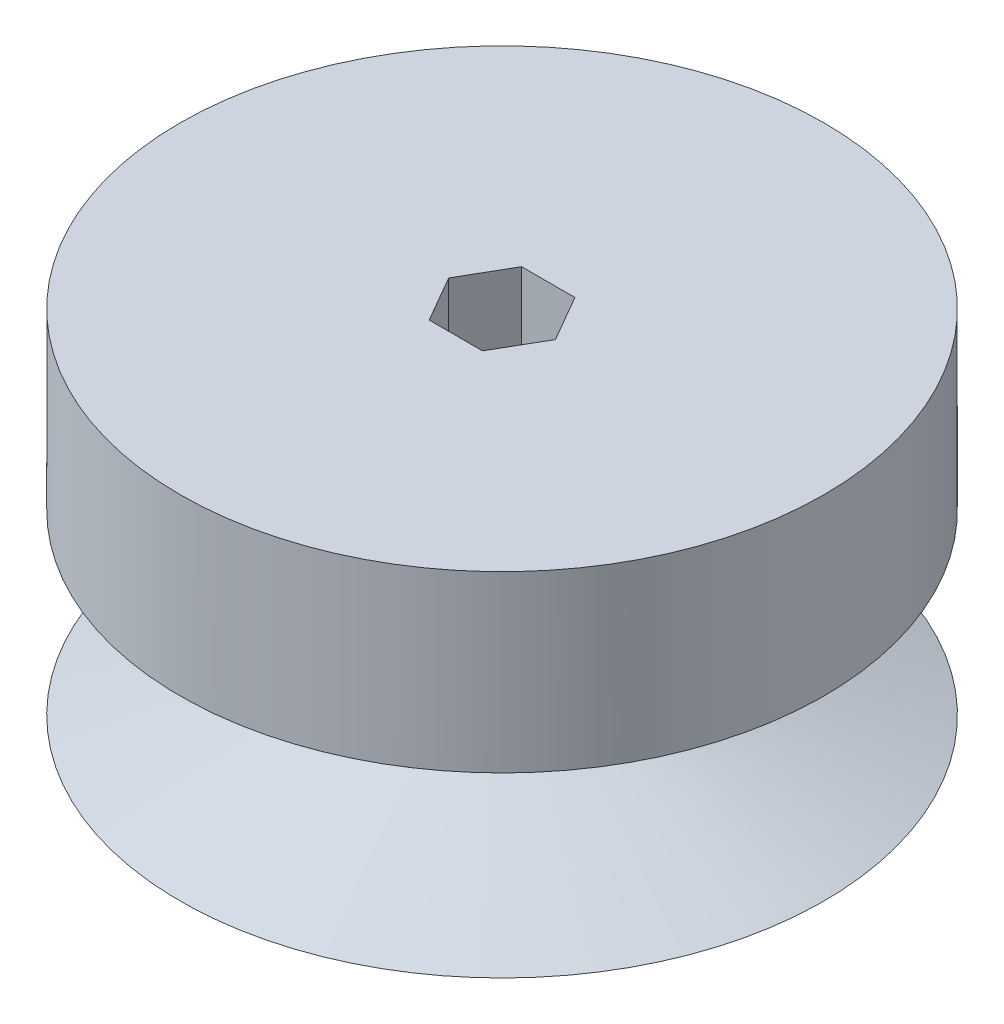
ISO-10303-21;
HEADER;
FILE_DESCRIPTION(('STEP AP214'),'2;1');
FILE_NAME('part.step','',(''),(''),'','','');
FILE_SCHEMA(('AUTOMOTIVE_DESIGN { 1 0 10303 214 1 1 1 1 }'));
ENDSEC;
DATA;
#1=APPLICATION_CONTEXT('core data for automotive mechanical design processes');
#2=APPLICATION_PROTOCOL_DEFINITION('international standard','automotive_design',2000,#1);
#3=PRODUCT_CONTEXT('',#1,'mechanical');
#4=PRODUCT('Part','Part','',(#3));
#5=PRODUCT_RELATED_PRODUCT_CATEGORY('part','',(#4));
#6=PRODUCT_DEFINITION_FORMATION('','',#4);
#7=PRODUCT_DEFINITION_CONTEXT('part definition',#1,'design');
#8=PRODUCT_DEFINITION('design','',#6,#7);
#9=PRODUCT_DEFINITION_SHAPE('','',#8);
#10=(LENGTH_UNIT() NAMED_UNIT(*) SI_UNIT(.MILLI.,.METRE.));
#11=(NAMED_UNIT(*) PLANE_ANGLE_UNIT() SI_UNIT($,.RADIAN.));
#12=(NAMED_UNIT(*) SI_UNIT($,.STERADIAN.) SOLID_ANGLE_UNIT());
#13=UNCERTAINTY_MEASURE_WITH_UNIT(LENGTH_MEASURE(1.E-05),#10,'distance_accuracy_value','');
#14=(GEOMETRIC_REPRESENTATION_CONTEXT(3) GLOBAL_UNCERTAINTY_ASSIGNED_CONTEXT((#13)) GLOBAL_UNIT_ASSIGNED_CONTEXT((#10,
#11,#12)) REPRESENTATION_CONTEXT('',''));
#15=CARTESIAN_POINT('',(0.,0.,0.));
#16=DIRECTION('',(0.,0.,1.));
#17=DIRECTION('',(1.,0.,0.));
#18=AXIS2_PLACEMENT_3D('',#15,#16,#17);
#19=CARTESIAN_POINT('',(0.,12.400000216,0.));
#20=DIRECTION('',(0.,-1.,0.));
#21=DIRECTION('',(0.,0.,1.));
#22=AXIS2_PLACEMENT_3D('',#19,#20,#21);
#23=PLANE('',#22);
#24=DIRECTION('',(-0.5,0.,0.866025403784439));
#25=VECTOR('',#24,1.);
#26=CARTESIAN_POINT('',(5.49926131403118,12.400000216,3.175));
#27=LINE('',#26,#25);
#28=CARTESIAN_POINT('',(7.33234841870825,12.400000216,0.));
#29=VERTEX_POINT('',#28);
#30=CARTESIAN_POINT('',(3.66617420935412,12.400000216,6.35));
#31=VERTEX_POINT('',#30);
#32=EDGE_CURVE('E148',#29,#31,#27,.T.);
#33=ORIENTED_EDGE('',*,*,#32,.F.);
#34=DIRECTION('',(0.5,0.,0.866025403784439));
#35=VECTOR('',#34,1.);
#36=CARTESIAN_POINT('',(5.49926131403119,12.400000216,-3.175));
#37=LINE('',#36,#35);
#38=CARTESIAN_POINT('',(3.66617420935412,12.400000216,-6.35));
#39=VERTEX_POINT('',#38);
#40=EDGE_CURVE('E133',#39,#29,#37,.T.);
#41=ORIENTED_EDGE('',*,*,#40,.F.);
#42=DIRECTION('',(1.,0.,0.));
#43=VECTOR('',#42,1.);
#44=CARTESIAN_POINT('',(0.,12.400000216,-6.35));
#45=LINE('',#44,#43);
#46=CARTESIAN_POINT('',(-3.66617420935412,12.400000216,-6.35));
#47=VERTEX_POINT('',#46);
#48=EDGE_CURVE('E106',#47,#39,#45,.T.);
#49=ORIENTED_EDGE('',*,*,#48,.F.);
#50=DIRECTION('',(0.5,0.,-0.866025403784439));
#51=VECTOR('',#50,1.);
#52=CARTESIAN_POINT('',(-5.49926131403118,12.400000216,-3.175));
#53=LINE('',#52,#51);
#54=CARTESIAN_POINT('',(-7.33234841870825,12.400000216,0.));
#55=VERTEX_POINT('',#54);
#56=EDGE_CURVE('E142',#55,#47,#53,.T.);
#57=ORIENTED_EDGE('',*,*,#56,.F.);
#58=DIRECTION('',(-0.5,0.,-0.866025403784439));
#59=VECTOR('',#58,1.);
#60=CARTESIAN_POINT('',(-5.49926131403118,12.400000216,3.175));
#61=LINE('',#60,#59);
#62=CARTESIAN_POINT('',(-3.66617420935412,12.400000216,6.35));
#63=VERTEX_POINT('',#62);
#64=EDGE_CURVE('E144',#63,#55,#61,.T.);
#65=ORIENTED_EDGE('',*,*,#64,.F.);
#66=DIRECTION('',(-1.,0.,0.));
#67=VECTOR('',#66,1.);
#68=CARTESIAN_POINT('',(0.,12.400000216,6.35));
#69=LINE('',#68,#67);
#70=EDGE_CURVE('E146',#31,#63,#69,.T.);
#71=ORIENTED_EDGE('',*,*,#70,.F.);
#72=EDGE_LOOP('',(#33,#41,#49,#57,#65,#71));
#73=FACE_BOUND('',#72,.T.);
#74=CARTESIAN_POINT('',(0.,12.400000216,0.));
#75=DIRECTION('',(0.,1.,0.));
#76=DIRECTION('',(0.,0.,1.));
#77=AXIS2_PLACEMENT_3D('',#74,#75,#76);
#78=CIRCLE('',#77,12.);
#79=CARTESIAN_POINT('',(0.,12.400000216,-12.));
#80=VERTEX_POINT('',#79);
#81=EDGE_CURVE('E55',#80,#80,#78,.T.);
#82=ORIENTED_EDGE('',*,*,#81,.F.);
#83=EDGE_LOOP('',(#82));
#84=FACE_BOUND('',#83,.T.);
#85=ADVANCED_FACE('F46',(#73,#84),#23,.T.);
#86=CARTESIAN_POINT('',(0.,12.400000216,0.));
#87=DIRECTION('',(0.,1.,0.));
#88=DIRECTION('',(0.,0.,-1.));
#89=AXIS2_PLACEMENT_3D('',#86,#87,#88);
#90=CONICAL_SURFACE('',#89,12.,1.21457667139875);
#91=CARTESIAN_POINT('',(0.,24.400000216,0.));
#92=DIRECTION('',(0.,1.,0.));
#93=DIRECTION('',(0.,0.,1.));
#94=AXIS2_PLACEMENT_3D('',#91,#92,#93);
#95=CIRCLE('',#94,44.25);
#96=CARTESIAN_POINT('',(0.,24.400000216,-44.25));
#97=VERTEX_POINT('',#96);
#98=EDGE_CURVE('E13',#97,#97,#95,.T.);
#99=CARTESIAN_POINT('',(0.,12.400000216,-12.));
#100=CARTESIAN_POINT('',(0.,12.525000216,-12.3359375));
#101=CARTESIAN_POINT('',(0.,12.650000216,-12.671875));
#102=CARTESIAN_POINT('',(0.,12.900000216,-13.34375));
#103=CARTESIAN_POINT('',(0.,13.025000216,-13.6796875));
#104=CARTESIAN_POINT('',(0.,13.275000216,-14.3515625));
#105=CARTESIAN_POINT('',(0.,13.400000216,-14.6875));
#106=CARTESIAN_POINT('',(0.,13.650000216,-15.359375));
#107=CARTESIAN_POINT('',(0.,13.775000216,-15.6953125));
#108=CARTESIAN_POINT('',(0.,14.025000216,-16.3671875));
#109=CARTESIAN_POINT('',(0.,14.150000216,-16.703125));
#110=CARTESIAN_POINT('',(0.,14.400000216,-17.375));
#111=CARTESIAN_POINT('',(0.,14.525000216,-17.7109375));
#112=CARTESIAN_POINT('',(0.,14.775000216,-18.3828125));
#113=CARTESIAN_POINT('',(0.,14.900000216,-18.71875));
#114=CARTESIAN_POINT('',(0.,15.150000216,-19.390625));
#115=CARTESIAN_POINT('',(0.,15.275000216,-19.7265625));
#116=CARTESIAN_POINT('',(0.,15.525000216,-20.3984375));
#117=CARTESIAN_POINT('',(0.,15.650000216,-20.734375));
#118=CARTESIAN_POINT('',(0.,15.900000216,-21.40625));
#119=CARTESIAN_POINT('',(0.,16.025000216,-21.7421875));
#120=CARTESIAN_POINT('',(0.,16.275000216,-22.4140625));
#121=CARTESIAN_POINT('',(0.,16.400000216,-22.75));
#122=CARTESIAN_POINT('',(0.,16.650000216,-23.421875));
#123=CARTESIAN_POINT('',(0.,16.775000216,-23.7578125));
#124=CARTESIAN_POINT('',(0.,17.025000216,-24.4296875));
#125=CARTESIAN_POINT('',(0.,17.150000216,-24.765625));
#126=CARTESIAN_POINT('',(0.,17.400000216,-25.4375));
#127=CARTESIAN_POINT('',(0.,17.525000216,-25.7734375));
#128=CARTESIAN_POINT('',(0.,17.775000216,-26.4453125));
#129=CARTESIAN_POINT('',(0.,17.900000216,-26.78125));
#130=CARTESIAN_POINT('',(0.,18.150000216,-27.453125));
#131=CARTESIAN_POINT('',(0.,18.275000216,-27.7890625));
#132=CARTESIAN_POINT('',(0.,18.525000216,-28.4609375));
#133=CARTESIAN_POINT('',(0.,18.650000216,-28.796875));
#134=CARTESIAN_POINT('',(0.,18.900000216,-29.46875));
#135=CARTESIAN_POINT('',(0.,19.025000216,-29.8046875));
#136=CARTESIAN_POINT('',(0.,19.275000216,-30.4765625));
#137=CARTESIAN_POINT('',(0.,19.400000216,-30.8125));
#138=CARTESIAN_POINT('',(0.,19.650000216,-31.484375));
#139=CARTESIAN_POINT('',(0.,19.775000216,-31.8203125));
#140=CARTESIAN_POINT('',(0.,20.025000216,-32.4921875));
#141=CARTESIAN_POINT('',(0.,20.150000216,-32.828125));
#142=CARTESIAN_POINT('',(0.,20.400000216,-33.5));
#143=CARTESIAN_POINT('',(0.,20.525000216,-33.8359375));
#144=CARTESIAN_POINT('',(0.,20.775000216,-34.5078125));
#145=CARTESIAN_POINT('',(0.,20.900000216,-34.84375));
#146=CARTESIAN_POINT('',(0.,21.150000216,-35.515625));
#147=CARTESIAN_POINT('',(0.,21.275000216,-35.8515625));
#148=CARTESIAN_POINT('',(0.,21.525000216,-36.5234375));
#149=CARTESIAN_POINT('',(0.,21.650000216,-36.859375));
#150=CARTESIAN_POINT('',(0.,21.900000216,-37.53125));
#151=CARTESIAN_POINT('',(0.,22.025000216,-37.8671875));
#152=CARTESIAN_POINT('',(0.,22.275000216,-38.5390625));
#153=CARTESIAN_POINT('',(0.,22.400000216,-38.875));
#154=CARTESIAN_POINT('',(0.,22.650000216,-39.546875));
#155=CARTESIAN_POINT('',(0.,22.775000216,-39.8828125));
#156=CARTESIAN_POINT('',(0.,23.025000216,-40.5546875));
#157=CARTESIAN_POINT('',(0.,23.150000216,-40.890625));
#158=CARTESIAN_POINT('',(0.,23.400000216,-41.5625));
#159=CARTESIAN_POINT('',(0.,23.525000216,-41.8984375));
#160=CARTESIAN_POINT('',(0.,23.775000216,-42.5703125));
#161=CARTESIAN_POINT('',(0.,23.900000216,-42.90625));
#162=CARTESIAN_POINT('',(0.,24.150000216,-43.578125));
#163=CARTESIAN_POINT('',(0.,24.275000216,-43.9140625));
#164=CARTESIAN_POINT('',(0.,24.400000216,-44.25));
#165=B_SPLINE_CURVE_WITH_KNOTS('',3,(#99,#100,#101,#102,#103,#104,#105,#106,#107,#108,#109,#110,
#111,#112,#113,#114,#115,#116,#117,#118,#119,#120,#121,#122,#123,#124,#125,#126,#127,#128,#129,
#130,#131,#132,#133,#134,#135,#136,#137,#138,#139,#140,#141,#142,#143,#144,#145,#146,#147,#148,
#149,#150,#151,#152,#153,#154,#155,#156,#157,#158,#159,#160,#161,#162,#163,#164),.UNSPECIFIED.,
.F.,.F.,(4,2,2,2,2,2,2,2,2,2,2,2,2,2,2,2,2,2,2,2,2,2,2,2,2,2,2,2,2,2,2,2,4),(0.,
1.07531903877698,2.15063807755396,3.22595711633094,4.30127615510792,5.3765951938849,
6.45191423266188,7.52723327143887,8.60255231021585,9.67787134899283,10.7531903877698,
11.8285094265468,12.9038284653238,13.9791475041008,15.0544665428777,16.1297855816547,
17.2051046204317,18.2804236592087,19.3557426979857,20.4310617367626,21.5063807755396,
22.5816998143166,23.6570188530936,24.7323378918706,25.8076569306475,26.8829759694245,
27.9582950082015,29.0336140469785,30.1089330857554,31.1842521245324,32.2595711633094,
33.3348902020864,34.4102092408634),.UNSPECIFIED.);
#166=EDGE_CURVE('BSEAM48',#80,#97,#165,.T.);
#167=ORIENTED_EDGE('',*,*,#81,.T.);
#168=ORIENTED_EDGE('',*,*,#98,.F.);
#169=ORIENTED_EDGE('',*,*,#166,.T.);
#170=ORIENTED_EDGE('',*,*,#166,.F.);
#171=EDGE_LOOP('',(#167,#169,#168,#170));
#172=FACE_BOUND('',#171,.T.);
#173=ADVANCED_FACE('F48',(#172),#90,.T.);
#174=CARTESIAN_POINT('',(0.,48.35600031,0.));
#175=DIRECTION('',(0.,-1.,0.));
#176=DIRECTION('',(0.,0.,-1.));
#177=AXIS2_PLACEMENT_3D('',#174,#175,#176);
#178=CYLINDRICAL_SURFACE('',#177,44.25);
#179=CARTESIAN_POINT('',(0.,48.35600031,0.));
#180=DIRECTION('',(0.,1.,0.));
#181=DIRECTION('',(0.,0.,1.));
#182=AXIS2_PLACEMENT_3D('',#179,#180,#181);
#183=CIRCLE('',#182,44.25);
#184=CARTESIAN_POINT('',(0.,48.35600031,44.25));
#185=VERTEX_POINT('',#184);
#186=EDGE_CURVE('E150',#185,#185,#183,.T.);
#187=ORIENTED_EDGE('',*,*,#186,.F.);
#188=EDGE_LOOP('',(#187));
#189=FACE_BOUND('',#188,.T.);
#190=ORIENTED_EDGE('',*,*,#98,.T.);
#191=EDGE_LOOP('',(#190));
#192=FACE_BOUND('',#191,.T.);
#193=ADVANCED_FACE('F179',(#189,#192),#178,.T.);
#194=CARTESIAN_POINT('',(0.,48.35600031,0.));
#195=DIRECTION('',(0.,1.,0.));
#196=DIRECTION('',(0.,0.,1.));
#197=AXIS2_PLACEMENT_3D('',#194,#195,#196);
#198=PLANE('',#197);
#199=DIRECTION('',(0.5,0.,-0.866025403784439));
#200=VECTOR('',#199,1.);
#201=CARTESIAN_POINT('',(3.66617420935412,48.35600031,6.35));
#202=LINE('',#201,#200);
#203=CARTESIAN_POINT('',(3.66617420935412,48.35600031,6.35));
#204=VERTEX_POINT('',#203);
#205=CARTESIAN_POINT('',(7.33234841870825,48.35600031,0.));
#206=VERTEX_POINT('',#205);
#207=EDGE_CURVE('E70',#204,#206,#202,.T.);
#208=ORIENTED_EDGE('',*,*,#207,.F.);
#209=DIRECTION('',(1.,0.,0.));
#210=VECTOR('',#209,1.);
#211=CARTESIAN_POINT('',(-3.66617420935412,48.35600031,6.35));
#212=LINE('',#211,#210);
#213=CARTESIAN_POINT('',(-3.66617420935412,48.35600031,6.35));
#214=VERTEX_POINT('',#213);
#215=EDGE_CURVE('E128',#214,#204,#212,.T.);
#216=ORIENTED_EDGE('',*,*,#215,.F.);
#217=DIRECTION('',(0.5,0.,0.866025403784439));
#218=VECTOR('',#217,1.);
#219=CARTESIAN_POINT('',(-7.33234841870825,48.35600031,0.));
#220=LINE('',#219,#218);
#221=CARTESIAN_POINT('',(-7.33234841870825,48.35600031,0.));
#222=VERTEX_POINT('',#221);
#223=EDGE_CURVE('E122',#222,#214,#220,.T.);
#224=ORIENTED_EDGE('',*,*,#223,.F.);
#225=DIRECTION('',(-0.5,0.,0.866025403784439));
#226=VECTOR('',#225,1.);
#227=CARTESIAN_POINT('',(-3.66617420935412,48.35600031,-6.35));
#228=LINE('',#227,#226);
#229=CARTESIAN_POINT('',(-3.66617420935412,48.35600031,-6.35));
#230=VERTEX_POINT('',#229);
#231=EDGE_CURVE('E120',#230,#222,#228,.T.);
#232=ORIENTED_EDGE('',*,*,#231,.F.);
#233=DIRECTION('',(-1.,0.,0.));
#234=VECTOR('',#233,1.);
#235=CARTESIAN_POINT('',(3.66617420935412,48.35600031,-6.35));
#236=LINE('',#235,#234);
#237=CARTESIAN_POINT('',(3.66617420935412,48.35600031,-6.35));
#238=VERTEX_POINT('',#237);
#239=EDGE_CURVE('E103',#238,#230,#236,.T.);
#240=ORIENTED_EDGE('',*,*,#239,.F.);
#241=DIRECTION('',(-0.5,0.,-0.866025403784439));
#242=VECTOR('',#241,1.);
#243=CARTESIAN_POINT('',(7.33234841870825,48.35600031,0.));
#244=LINE('',#243,#242);
#245=EDGE_CURVE('E112',#206,#238,#244,.T.);
#246=ORIENTED_EDGE('',*,*,#245,.F.);
#247=EDGE_LOOP('',(#208,#216,#224,#232,#240,#246));
#248=FACE_BOUND('',#247,.T.);
#249=ORIENTED_EDGE('',*,*,#186,.T.);
#250=EDGE_LOOP('',(#249));
#251=FACE_BOUND('',#250,.T.);
#252=ADVANCED_FACE('F116',(#248,#251),#198,.T.);
#253=CARTESIAN_POINT('',(3.66617420935412,-9.99999999959367E-05,6.35));
#254=DIRECTION('',(0.866025403784439,0.,0.5));
#255=DIRECTION('',(0.5,0.,-0.866025403784439));
#256=AXIS2_PLACEMENT_3D('',#253,#254,#255);
#257=PLANE('',#256);
#258=ORIENTED_EDGE('',*,*,#32,.T.);
#259=DIRECTION('',(0.,1.,0.));
#260=VECTOR('',#259,1.);
#261=CARTESIAN_POINT('',(3.66617420935412,-9.99999999959367E-05,6.35));
#262=LINE('',#261,#260);
#263=EDGE_CURVE('E131',#31,#204,#262,.T.);
#264=ORIENTED_EDGE('',*,*,#263,.T.);
#265=ORIENTED_EDGE('',*,*,#207,.T.);
#266=DIRECTION('',(0.,1.,0.));
#267=VECTOR('',#266,1.);
#268=CARTESIAN_POINT('',(7.33234841870825,-9.99999999959367E-05,0.));
#269=LINE('',#268,#267);
#270=EDGE_CURVE('E109',#29,#206,#269,.T.);
#271=ORIENTED_EDGE('',*,*,#270,.F.);
#272=EDGE_LOOP('',(#258,#264,#265,#271));
#273=FACE_BOUND('',#272,.T.);
#274=ADVANCED_FACE('F185',(#273),#257,.F.);
#275=CARTESIAN_POINT('',(-3.66617420935412,-9.99999999959367E-05,6.35));
#276=DIRECTION('',(0.,0.,1.));
#277=DIRECTION('',(1.,0.,0.));
#278=AXIS2_PLACEMENT_3D('',#275,#276,#277);
#279=PLANE('',#278);
#280=ORIENTED_EDGE('',*,*,#70,.T.);
#281=DIRECTION('',(0.,1.,0.));
#282=VECTOR('',#281,1.);
#283=CARTESIAN_POINT('',(-3.66617420935412,-9.99999999959367E-05,6.35));
#284=LINE('',#283,#282);
#285=EDGE_CURVE('E134',#63,#214,#284,.T.);
#286=ORIENTED_EDGE('',*,*,#285,.T.);
#287=ORIENTED_EDGE('',*,*,#215,.T.);
#288=ORIENTED_EDGE('',*,*,#263,.F.);
#289=EDGE_LOOP('',(#280,#286,#287,#288));
#290=FACE_BOUND('',#289,.T.);
#291=ADVANCED_FACE('F188',(#290),#279,.F.);
#292=CARTESIAN_POINT('',(-7.33234841870825,-9.99999999959367E-05,0.));
#293=DIRECTION('',(-0.866025403784439,0.,0.5));
#294=DIRECTION('',(0.5,0.,0.866025403784439));
#295=AXIS2_PLACEMENT_3D('',#292,#293,#294);
#296=PLANE('',#295);
#297=ORIENTED_EDGE('',*,*,#64,.T.);
#298=DIRECTION('',(0.,1.,0.));
#299=VECTOR('',#298,1.);
#300=CARTESIAN_POINT('',(-7.33234841870825,-9.99999999959367E-05,0.));
#301=LINE('',#300,#299);
#302=EDGE_CURVE('E136',#55,#222,#301,.T.);
#303=ORIENTED_EDGE('',*,*,#302,.T.);
#304=ORIENTED_EDGE('',*,*,#223,.T.);
#305=ORIENTED_EDGE('',*,*,#285,.F.);
#306=EDGE_LOOP('',(#297,#303,#304,#305));
#307=FACE_BOUND('',#306,.T.);
#308=ADVANCED_FACE('F196',(#307),#296,.F.);
#309=CARTESIAN_POINT('',(-3.66617420935412,-9.99999999959367E-05,-6.35));
#310=DIRECTION('',(-0.866025403784439,0.,-0.5));
#311=DIRECTION('',(-0.5,0.,0.866025403784439));
#312=AXIS2_PLACEMENT_3D('',#309,#310,#311);
#313=PLANE('',#312);
#314=ORIENTED_EDGE('',*,*,#56,.T.);
#315=DIRECTION('',(0.,1.,0.));
#316=VECTOR('',#315,1.);
#317=CARTESIAN_POINT('',(-3.66617420935412,-9.99999999959367E-05,-6.35));
#318=LINE('',#317,#316);
#319=EDGE_CURVE('E108',#47,#230,#318,.T.);
#320=ORIENTED_EDGE('',*,*,#319,.T.);
#321=ORIENTED_EDGE('',*,*,#231,.T.);
#322=ORIENTED_EDGE('',*,*,#302,.F.);
#323=EDGE_LOOP('',(#314,#320,#321,#322));
#324=FACE_BOUND('',#323,.T.);
#325=ADVANCED_FACE('F193',(#324),#313,.F.);
#326=CARTESIAN_POINT('',(3.66617420935412,-9.99999999959367E-05,-6.35));
#327=DIRECTION('',(0.,0.,-1.));
#328=DIRECTION('',(-1.,0.,0.));
#329=AXIS2_PLACEMENT_3D('',#326,#327,#328);
#330=PLANE('',#329);
#331=ORIENTED_EDGE('',*,*,#48,.T.);
#332=DIRECTION('',(0.,1.,0.));
#333=VECTOR('',#332,1.);
#334=CARTESIAN_POINT('',(3.66617420935412,-9.99999999959367E-05,-6.35));
#335=LINE('',#334,#333);
#336=EDGE_CURVE('E62',#39,#238,#335,.T.);
#337=ORIENTED_EDGE('',*,*,#336,.T.);
#338=ORIENTED_EDGE('',*,*,#239,.T.);
#339=ORIENTED_EDGE('',*,*,#319,.F.);
#340=EDGE_LOOP('',(#331,#337,#338,#339));
#341=FACE_BOUND('',#340,.T.);
#342=ADVANCED_FACE('F100',(#341),#330,.F.);
#343=CARTESIAN_POINT('',(7.33234841870825,-9.99999999959367E-05,0.));
#344=DIRECTION('',(0.866025403784439,0.,-0.5));
#345=DIRECTION('',(-0.5,0.,-0.866025403784439));
#346=AXIS2_PLACEMENT_3D('',#343,#344,#345);
#347=PLANE('',#346);
#348=ORIENTED_EDGE('',*,*,#40,.T.);
#349=ORIENTED_EDGE('',*,*,#270,.T.);
#350=ORIENTED_EDGE('',*,*,#245,.T.);
#351=ORIENTED_EDGE('',*,*,#336,.F.);
#352=EDGE_LOOP('',(#348,#349,#350,#351));
#353=FACE_BOUND('',#352,.T.);
#354=ADVANCED_FACE('F113',(#353),#347,.F.);
#355=CLOSED_SHELL('',(#85,#173,#193,#252,#274,#291,#308,#325,#342,#354));
#356=MANIFOLD_SOLID_BREP('B2',#355);
#357=CARTESIAN_POINT('',(0.,0.,0.));
#358=DIRECTION('',(0.,1.,0.));
#359=DIRECTION('',(0.,0.,1.));
#360=AXIS2_PLACEMENT_3D('',#357,#358,#359);
#361=PLANE('',#360);
#362=DIRECTION('',(1.,0.,0.));
#363=VECTOR('',#362,1.);
#364=CARTESIAN_POINT('',(0.,0.,6.35));
#365=LINE('',#364,#363);
#366=CARTESIAN_POINT('',(-3.66617420935412,0.,6.35));
#367=VERTEX_POINT('',#366);
#368=CARTESIAN_POINT('',(3.66617420935412,0.,6.35));
#369=VERTEX_POINT('',#368);
#370=EDGE_CURVE('E347',#367,#369,#365,.T.);
#371=ORIENTED_EDGE('',*,*,#370,.T.);
#372=DIRECTION('',(0.5,0.,-0.866025403784439));
#373=VECTOR('',#372,1.);
#374=CARTESIAN_POINT('',(5.49926131403118,0.,3.175));
#375=LINE('',#374,#373);
#376=CARTESIAN_POINT('',(7.33234841870825,0.,0.));
#377=VERTEX_POINT('',#376);
#378=EDGE_CURVE('E339',#369,#377,#375,.T.);
#379=ORIENTED_EDGE('',*,*,#378,.T.);
#380=DIRECTION('',(-0.5,0.,-0.866025403784439));
#381=VECTOR('',#380,1.);
#382=CARTESIAN_POINT('',(5.49926131403119,0.,-3.175));
#383=LINE('',#382,#381);
#384=CARTESIAN_POINT('',(3.66617420935412,0.,-6.35));
#385=VERTEX_POINT('',#384);
#386=EDGE_CURVE('E328',#377,#385,#383,.T.);
#387=ORIENTED_EDGE('',*,*,#386,.T.);
#388=DIRECTION('',(-1.,0.,0.));
#389=VECTOR('',#388,1.);
#390=CARTESIAN_POINT('',(0.,0.,-6.35));
#391=LINE('',#390,#389);
#392=CARTESIAN_POINT('',(-3.66617420935412,0.,-6.35));
#393=VERTEX_POINT('',#392);
#394=EDGE_CURVE('E333',#385,#393,#391,.T.);
#395=ORIENTED_EDGE('',*,*,#394,.T.);
#396=DIRECTION('',(-0.5,0.,0.866025403784439));
#397=VECTOR('',#396,1.);
#398=CARTESIAN_POINT('',(-5.49926131403118,0.,-3.175));
#399=LINE('',#398,#397);
#400=CARTESIAN_POINT('',(-7.33234841870825,0.,0.));
#401=VERTEX_POINT('',#400);
#402=EDGE_CURVE('E440',#393,#401,#399,.T.);
#403=ORIENTED_EDGE('',*,*,#402,.T.);
#404=DIRECTION('',(0.5,0.,0.866025403784439));
#405=VECTOR('',#404,1.);
#406=CARTESIAN_POINT('',(-5.49926131403118,0.,3.175));
#407=LINE('',#406,#405);
#408=EDGE_CURVE('E353',#401,#367,#407,.T.);
#409=ORIENTED_EDGE('',*,*,#408,.T.);
#410=EDGE_LOOP('',(#371,#379,#387,#395,#403,#409));
#411=FACE_BOUND('',#410,.T.);
#412=CARTESIAN_POINT('',(0.,0.,0.));
#413=DIRECTION('',(0.,1.,0.));
#414=DIRECTION('',(0.,0.,1.));
#415=AXIS2_PLACEMENT_3D('',#412,#413,#414);
#416=CIRCLE('',#415,44.25);
#417=CARTESIAN_POINT('',(0.,0.,-44.25));
#418=VERTEX_POINT('',#417);
#419=EDGE_CURVE('E351',#418,#418,#416,.T.);
#420=ORIENTED_EDGE('',*,*,#419,.F.);
#421=EDGE_LOOP('',(#420));
#422=FACE_BOUND('',#421,.T.);
#423=ADVANCED_FACE('F279',(#411,#422),#361,.F.);
#424=CARTESIAN_POINT('',(0.,12.,0.));
#425=DIRECTION('',(0.,1.,0.));
#426=DIRECTION('',(0.,0.,1.));
#427=AXIS2_PLACEMENT_3D('',#424,#425,#426);
#428=PLANE('',#427);
#429=DIRECTION('',(0.5,0.,-0.866025403784439));
#430=VECTOR('',#429,1.);
#431=CARTESIAN_POINT('',(5.49926131403118,12.,3.175));
#432=LINE('',#431,#430);
#433=CARTESIAN_POINT('',(3.66617420935412,12.,6.35));
#434=VERTEX_POINT('',#433);
#435=CARTESIAN_POINT('',(7.33234841870825,12.,0.));
#436=VERTEX_POINT('',#435);
#437=EDGE_CURVE('E44',#434,#436,#432,.T.);
#438=ORIENTED_EDGE('',*,*,#437,.F.);
#439=DIRECTION('',(1.,0.,0.));
#440=VECTOR('',#439,1.);
#441=CARTESIAN_POINT('',(0.,12.,6.35));
#442=LINE('',#441,#440);
#443=CARTESIAN_POINT('',(-3.66617420935412,12.,6.35));
#444=VERTEX_POINT('',#443);
#445=EDGE_CURVE('E287',#444,#434,#442,.T.);
#446=ORIENTED_EDGE('',*,*,#445,.F.);
#447=DIRECTION('',(0.5,0.,0.866025403784439));
#448=VECTOR('',#447,1.);
#449=CARTESIAN_POINT('',(-5.49926131403118,12.,3.175));
#450=LINE('',#449,#448);
#451=CARTESIAN_POINT('',(-7.33234841870825,12.,0.));
#452=VERTEX_POINT('',#451);
#453=EDGE_CURVE('E417',#452,#444,#450,.T.);
#454=ORIENTED_EDGE('',*,*,#453,.F.);
#455=DIRECTION('',(-0.5,0.,0.866025403784439));
#456=VECTOR('',#455,1.);
#457=CARTESIAN_POINT('',(-5.49926131403118,12.,-3.175));
#458=LINE('',#457,#456);
#459=CARTESIAN_POINT('',(-3.66617420935412,12.,-6.35));
#460=VERTEX_POINT('',#459);
#461=EDGE_CURVE('E415',#460,#452,#458,.T.);
#462=ORIENTED_EDGE('',*,*,#461,.F.);
#463=DIRECTION('',(-1.,0.,0.));
#464=VECTOR('',#463,1.);
#465=CARTESIAN_POINT('',(0.,12.,-6.35));
#466=LINE('',#465,#464);
#467=CARTESIAN_POINT('',(3.66617420935412,12.,-6.35));
#468=VERTEX_POINT('',#467);
#469=EDGE_CURVE('E413',#468,#460,#466,.T.);
#470=ORIENTED_EDGE('',*,*,#469,.F.);
#471=DIRECTION('',(-0.5,0.,-0.866025403784439));
#472=VECTOR('',#471,1.);
#473=CARTESIAN_POINT('',(5.49926131403119,12.,-3.175));
#474=LINE('',#473,#472);
#475=EDGE_CURVE('E409',#436,#468,#474,.T.);
#476=ORIENTED_EDGE('',*,*,#475,.F.);
#477=EDGE_LOOP('',(#438,#446,#454,#462,#470,#476));
#478=FACE_BOUND('',#477,.T.);
#479=CARTESIAN_POINT('',(0.,12.,0.));
#480=DIRECTION('',(0.,1.,0.));
#481=DIRECTION('',(0.,0.,1.));
#482=AXIS2_PLACEMENT_3D('',#479,#480,#481);
#483=CIRCLE('',#482,12.);
#484=CARTESIAN_POINT('',(0.,12.,-12.));
#485=VERTEX_POINT('',#484);
#486=EDGE_CURVE('E348',#485,#485,#483,.T.);
#487=ORIENTED_EDGE('',*,*,#486,.T.);
#488=EDGE_LOOP('',(#487));
#489=FACE_BOUND('',#488,.T.);
#490=ADVANCED_FACE('F374',(#478,#489),#428,.T.);
#491=CARTESIAN_POINT('',(0.,12.,0.));
#492=DIRECTION('',(0.,-1.,0.));
#493=DIRECTION('',(0.,0.,-1.));
#494=AXIS2_PLACEMENT_3D('',#491,#492,#493);
#495=CONICAL_SURFACE('',#494,12.,1.21457667139875);
#496=CARTESIAN_POINT('',(0.,12.,-12.));
#497=CARTESIAN_POINT('',(0.,11.875,-12.3359375));
#498=CARTESIAN_POINT('',(0.,11.75,-12.671875));
#499=CARTESIAN_POINT('',(0.,11.5,-13.34375));
#500=CARTESIAN_POINT('',(0.,11.375,-13.6796875));
#501=CARTESIAN_POINT('',(0.,11.125,-14.3515625));
#502=CARTESIAN_POINT('',(0.,11.,-14.6875));
#503=CARTESIAN_POINT('',(0.,10.75,-15.359375));
#504=CARTESIAN_POINT('',(0.,10.625,-15.6953125));
#505=CARTESIAN_POINT('',(0.,10.375,-16.3671875));
#506=CARTESIAN_POINT('',(0.,10.25,-16.703125));
#507=CARTESIAN_POINT('',(0.,10.,-17.375));
#508=CARTESIAN_POINT('',(0.,9.875,-17.7109375));
#509=CARTESIAN_POINT('',(0.,9.625,-18.3828125));
#510=CARTESIAN_POINT('',(0.,9.5,-18.71875));
#511=CARTESIAN_POINT('',(0.,9.25,-19.390625));
#512=CARTESIAN_POINT('',(0.,9.125,-19.7265625));
#513=CARTESIAN_POINT('',(0.,8.875,-20.3984375));
#514=CARTESIAN_POINT('',(0.,8.75,-20.734375));
#515=CARTESIAN_POINT('',(0.,8.5,-21.40625));
#516=CARTESIAN_POINT('',(0.,8.375,-21.7421875));
#517=CARTESIAN_POINT('',(0.,8.125,-22.4140625));
#518=CARTESIAN_POINT('',(0.,8.,-22.75));
#519=CARTESIAN_POINT('',(0.,7.75,-23.421875));
#520=CARTESIAN_POINT('',(0.,7.625,-23.7578125));
#521=CARTESIAN_POINT('',(0.,7.375,-24.4296875));
#522=CARTESIAN_POINT('',(0.,7.25,-24.765625));
#523=CARTESIAN_POINT('',(0.,7.,-25.4375));
#524=CARTESIAN_POINT('',(0.,6.875,-25.7734375));
#525=CARTESIAN_POINT('',(0.,6.625,-26.4453125));
#526=CARTESIAN_POINT('',(0.,6.5,-26.78125));
#527=CARTESIAN_POINT('',(0.,6.25,-27.453125));
#528=CARTESIAN_POINT('',(0.,6.125,-27.7890625));
#529=CARTESIAN_POINT('',(0.,5.875,-28.4609375));
#530=CARTESIAN_POINT('',(0.,5.75,-28.796875));
#531=CARTESIAN_POINT('',(0.,5.5,-29.46875));
#532=CARTESIAN_POINT('',(0.,5.375,-29.8046875));
#533=CARTESIAN_POINT('',(0.,5.125,-30.4765625));
#534=CARTESIAN_POINT('',(0.,5.,-30.8125));
#535=CARTESIAN_POINT('',(0.,4.75,-31.484375));
#536=CARTESIAN_POINT('',(0.,4.625,-31.8203125));
#537=CARTESIAN_POINT('',(0.,4.375,-32.4921875));
#538=CARTESIAN_POINT('',(0.,4.25,-32.828125));
#539=CARTESIAN_POINT('',(0.,4.,-33.5));
#540=CARTESIAN_POINT('',(0.,3.875,-33.8359375));
#541=CARTESIAN_POINT('',(0.,3.625,-34.5078125));
#542=CARTESIAN_POINT('',(0.,3.5,-34.84375));
#543=CARTESIAN_POINT('',(0.,3.25,-35.515625));
#544=CARTESIAN_POINT('',(0.,3.125,-35.8515625));
#545=CARTESIAN_POINT('',(0.,2.875,-36.5234375));
#546=CARTESIAN_POINT('',(0.,2.75,-36.859375));
#547=CARTESIAN_POINT('',(0.,2.5,-37.53125));
#548=CARTESIAN_POINT('',(0.,2.375,-37.8671875));
#549=CARTESIAN_POINT('',(0.,2.125,-38.5390625));
#550=CARTESIAN_POINT('',(0.,2.,-38.875));
#551=CARTESIAN_POINT('',(0.,1.75,-39.546875));
#552=CARTESIAN_POINT('',(0.,1.625,-39.8828125));
#553=CARTESIAN_POINT('',(0.,1.375,-40.5546875));
#554=CARTESIAN_POINT('',(0.,1.25,-40.890625));
#555=CARTESIAN_POINT('',(0.,0.999999999999999,-41.5625));
#556=CARTESIAN_POINT('',(0.,0.875,-41.8984375));
#557=CARTESIAN_POINT('',(0.,0.625000000000001,-42.5703125));
#558=CARTESIAN_POINT('',(0.,0.5,-42.90625));
#559=CARTESIAN_POINT('',(0.,0.25,-43.578125));
#560=CARTESIAN_POINT('',(0.,0.125,-43.9140625));
#561=CARTESIAN_POINT('',(0.,0.,-44.25));
#562=B_SPLINE_CURVE_WITH_KNOTS('',3,(#496,#497,#498,#499,#500,#501,#502,#503,#504,#505,#506,
#507,#508,#509,#510,#511,#512,#513,#514,#515,#516,#517,#518,#519,#520,#521,#522,#523,#524,#525,
#526,#527,#528,#529,#530,#531,#532,#533,#534,#535,#536,#537,#538,#539,#540,#541,#542,#543,#544,
#545,#546,#547,#548,#549,#550,#551,#552,#553,#554,#555,#556,#557,#558,#559,#560,#561),
.UNSPECIFIED.,.F.,.F.,(4,2,2,2,2,2,2,2,2,2,2,2,2,2,2,2,2,2,2,2,2,2,2,2,2,2,2,2,2,2,2,2,4),(0.,
1.07531903877698,2.15063807755396,3.22595711633094,4.30127615510792,5.3765951938849,
6.45191423266188,7.52723327143886,8.60255231021585,9.67787134899283,10.7531903877698,
11.8285094265468,12.9038284653238,13.9791475041008,15.0544665428777,16.1297855816547,
17.2051046204317,18.2804236592087,19.3557426979857,20.4310617367626,21.5063807755396,
22.5816998143166,23.6570188530936,24.7323378918706,25.8076569306475,26.8829759694245,
27.9582950082015,29.0336140469785,30.1089330857555,31.1842521245324,32.2595711633094,
33.3348902020864,34.4102092408634),.UNSPECIFIED.);
#563=EDGE_CURVE('BSEAM365',#485,#418,#562,.T.);
#564=ORIENTED_EDGE('',*,*,#486,.F.);
#565=ORIENTED_EDGE('',*,*,#419,.T.);
#566=ORIENTED_EDGE('',*,*,#563,.T.);
#567=ORIENTED_EDGE('',*,*,#563,.F.);
#568=EDGE_LOOP('',(#564,#566,#565,#567));
#569=FACE_BOUND('',#568,.T.);
#570=ADVANCED_FACE('F365',(#569),#495,.T.);
#571=CARTESIAN_POINT('',(3.66617420935412,-9.99999999959367E-05,6.35));
#572=DIRECTION('',(0.866025403784439,0.,0.5));
#573=DIRECTION('',(0.5,0.,-0.866025403784439));
#574=AXIS2_PLACEMENT_3D('',#571,#572,#573);
#575=PLANE('',#574);
#576=DIRECTION('',(0.,1.,0.));
#577=VECTOR('',#576,1.);
#578=CARTESIAN_POINT('',(3.66617420935412,-9.99999999959367E-05,6.35));
#579=LINE('',#578,#577);
#580=EDGE_CURVE('E334',#369,#434,#579,.T.);
#581=ORIENTED_EDGE('',*,*,#580,.T.);
#582=ORIENTED_EDGE('',*,*,#437,.T.);
#583=DIRECTION('',(0.,1.,0.));
#584=VECTOR('',#583,1.);
#585=CARTESIAN_POINT('',(7.33234841870825,-9.99999999959367E-05,0.));
#586=LINE('',#585,#584);
#587=EDGE_CURVE('E299',#377,#436,#586,.T.);
#588=ORIENTED_EDGE('',*,*,#587,.F.);
#589=ORIENTED_EDGE('',*,*,#378,.F.);
#590=EDGE_LOOP('',(#581,#582,#588,#589));
#591=FACE_BOUND('',#590,.T.);
#592=ADVANCED_FACE('F338',(#591),#575,.F.);
#593=CARTESIAN_POINT('',(-3.66617420935412,-9.99999999959367E-05,6.35));
#594=DIRECTION('',(0.,0.,1.));
#595=DIRECTION('',(1.,0.,0.));
#596=AXIS2_PLACEMENT_3D('',#593,#594,#595);
#597=PLANE('',#596);
#598=DIRECTION('',(0.,1.,0.));
#599=VECTOR('',#598,1.);
#600=CARTESIAN_POINT('',(-3.66617420935412,-9.99999999959367E-05,6.35));
#601=LINE('',#600,#599);
#602=EDGE_CURVE('E423',#367,#444,#601,.T.);
#603=ORIENTED_EDGE('',*,*,#602,.T.);
#604=ORIENTED_EDGE('',*,*,#445,.T.);
#605=ORIENTED_EDGE('',*,*,#580,.F.);
#606=ORIENTED_EDGE('',*,*,#370,.F.);
#607=EDGE_LOOP('',(#603,#604,#605,#606));
#608=FACE_BOUND('',#607,.T.);
#609=ADVANCED_FACE('F421',(#608),#597,.F.);
#610=CARTESIAN_POINT('',(-7.33234841870825,-9.99999999959367E-05,0.));
#611=DIRECTION('',(-0.866025403784439,0.,0.5));
#612=DIRECTION('',(0.5,0.,0.866025403784439));
#613=AXIS2_PLACEMENT_3D('',#610,#611,#612);
#614=PLANE('',#613);
#615=DIRECTION('',(0.,1.,0.));
#616=VECTOR('',#615,1.);
#617=CARTESIAN_POINT('',(-7.33234841870825,-9.99999999959367E-05,0.));
#618=LINE('',#617,#616);
#619=EDGE_CURVE('E435',#401,#452,#618,.T.);
#620=ORIENTED_EDGE('',*,*,#619,.T.);
#621=ORIENTED_EDGE('',*,*,#453,.T.);
#622=ORIENTED_EDGE('',*,*,#602,.F.);
#623=ORIENTED_EDGE('',*,*,#408,.F.);
#624=EDGE_LOOP('',(#620,#621,#622,#623));
#625=FACE_BOUND('',#624,.T.);
#626=ADVANCED_FACE('F445',(#625),#614,.F.);
#627=CARTESIAN_POINT('',(-3.66617420935412,-9.99999999959367E-05,-6.35));
#628=DIRECTION('',(-0.866025403784439,0.,-0.5));
#629=DIRECTION('',(-0.5,0.,0.866025403784439));
#630=AXIS2_PLACEMENT_3D('',#627,#628,#629);
#631=PLANE('',#630);
#632=DIRECTION('',(0.,1.,0.));
#633=VECTOR('',#632,1.);
#634=CARTESIAN_POINT('',(-3.66617420935412,-9.99999999959367E-05,-6.35));
#635=LINE('',#634,#633);
#636=EDGE_CURVE('E433',#393,#460,#635,.T.);
#637=ORIENTED_EDGE('',*,*,#636,.T.);
#638=ORIENTED_EDGE('',*,*,#461,.T.);
#639=ORIENTED_EDGE('',*,*,#619,.F.);
#640=ORIENTED_EDGE('',*,*,#402,.F.);
#641=EDGE_LOOP('',(#637,#638,#639,#640));
#642=FACE_BOUND('',#641,.T.);
#643=ADVANCED_FACE('F447',(#642),#631,.F.);
#644=CARTESIAN_POINT('',(3.66617420935412,-9.99999999959367E-05,-6.35));
#645=DIRECTION('',(0.,0.,-1.));
#646=DIRECTION('',(-1.,0.,0.));
#647=AXIS2_PLACEMENT_3D('',#644,#645,#646);
#648=PLANE('',#647);
#649=DIRECTION('',(0.,1.,0.));
#650=VECTOR('',#649,1.);
#651=CARTESIAN_POINT('',(3.66617420935412,-9.99999999959367E-05,-6.35));
#652=LINE('',#651,#650);
#653=EDGE_CURVE('E294',#385,#468,#652,.T.);
#654=ORIENTED_EDGE('',*,*,#653,.T.);
#655=ORIENTED_EDGE('',*,*,#469,.T.);
#656=ORIENTED_EDGE('',*,*,#636,.F.);
#657=ORIENTED_EDGE('',*,*,#394,.F.);
#658=EDGE_LOOP('',(#654,#655,#656,#657));
#659=FACE_BOUND('',#658,.T.);
#660=ADVANCED_FACE('F430',(#659),#648,.F.);
#661=CARTESIAN_POINT('',(7.33234841870825,-9.99999999959367E-05,0.));
#662=DIRECTION('',(0.866025403784439,0.,-0.5));
#663=DIRECTION('',(-0.5,0.,-0.866025403784439));
#664=AXIS2_PLACEMENT_3D('',#661,#662,#663);
#665=PLANE('',#664);
#666=ORIENTED_EDGE('',*,*,#587,.T.);
#667=ORIENTED_EDGE('',*,*,#475,.T.);
#668=ORIENTED_EDGE('',*,*,#653,.F.);
#669=ORIENTED_EDGE('',*,*,#386,.F.);
#670=EDGE_LOOP('',(#666,#667,#668,#669));
#671=FACE_BOUND('',#670,.T.);
#672=ADVANCED_FACE('F329',(#671),#665,.F.);
#673=CLOSED_SHELL('',(#423,#490,#570,#592,#609,#626,#643,#660,#672));
#674=MANIFOLD_SOLID_BREP('B7',#673);
#675=ADVANCED_BREP_SHAPE_REPRESENTATION('',(#18,#356,#674),#14);
#676=SHAPE_DEFINITION_REPRESENTATION(#9,#675);
ENDSEC;
END-ISO-10303-21;
